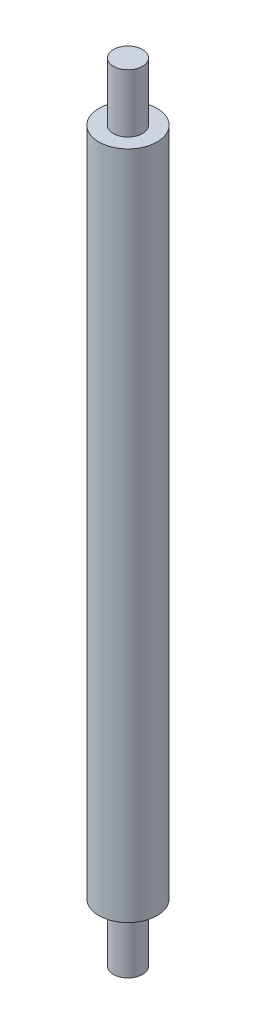
ISO-10303-21;
HEADER;
FILE_DESCRIPTION(('STEP AP214'),'2;1');
FILE_NAME('part.step','',(''),(''),'','','');
FILE_SCHEMA(('AUTOMOTIVE_DESIGN { 1 0 10303 214 1 1 1 1 }'));
ENDSEC;
DATA;
#1=APPLICATION_CONTEXT('core data for automotive mechanical design processes');
#2=APPLICATION_PROTOCOL_DEFINITION('international standard','automotive_design',2000,#1);
#3=PRODUCT_CONTEXT('',#1,'mechanical');
#4=PRODUCT('Part','Part','',(#3));
#5=PRODUCT_RELATED_PRODUCT_CATEGORY('part','',(#4));
#6=PRODUCT_DEFINITION_FORMATION('','',#4);
#7=PRODUCT_DEFINITION_CONTEXT('part definition',#1,'design');
#8=PRODUCT_DEFINITION('design','',#6,#7);
#9=PRODUCT_DEFINITION_SHAPE('','',#8);
#10=(LENGTH_UNIT() NAMED_UNIT(*) SI_UNIT(.MILLI.,.METRE.));
#11=(NAMED_UNIT(*) PLANE_ANGLE_UNIT() SI_UNIT($,.RADIAN.));
#12=(NAMED_UNIT(*) SI_UNIT($,.STERADIAN.) SOLID_ANGLE_UNIT());
#13=UNCERTAINTY_MEASURE_WITH_UNIT(LENGTH_MEASURE(1.E-05),#10,'distance_accuracy_value','');
#14=(GEOMETRIC_REPRESENTATION_CONTEXT(3) GLOBAL_UNCERTAINTY_ASSIGNED_CONTEXT((#13)) GLOBAL_UNIT_ASSIGNED_CONTEXT((#10,
#11,#12)) REPRESENTATION_CONTEXT('',''));
#15=CARTESIAN_POINT('',(0.,0.,0.));
#16=DIRECTION('',(0.,0.,1.));
#17=DIRECTION('',(1.,0.,0.));
#18=AXIS2_PLACEMENT_3D('',#15,#16,#17);
#19=CARTESIAN_POINT('',(-0.951287670134509,115.,2.46214322013451));
#20=DIRECTION('',(0.,-1.,0.));
#21=DIRECTION('',(0.,0.,-1.));
#22=AXIS2_PLACEMENT_3D('',#19,#20,#21);
#23=CYLINDRICAL_SURFACE('',#22,5.);
#24=CARTESIAN_POINT('',(-0.951287670134509,115.,2.46214322013451));
#25=DIRECTION('',(0.,1.,0.));
#26=DIRECTION('',(0.,0.,1.));
#27=AXIS2_PLACEMENT_3D('',#24,#25,#26);
#28=CIRCLE('',#27,5.);
#29=CARTESIAN_POINT('',(-0.951287670134509,115.,7.46214322013451));
#30=VERTEX_POINT('',#29);
#31=EDGE_CURVE('E38',#30,#30,#28,.T.);
#32=ORIENTED_EDGE('',*,*,#31,.F.);
#33=EDGE_LOOP('',(#32));
#34=FACE_BOUND('',#33,.T.);
#35=CARTESIAN_POINT('',(-0.951287670134509,0.,2.46214322013451));
#36=DIRECTION('',(0.,1.,0.));
#37=DIRECTION('',(0.,0.,1.));
#38=AXIS2_PLACEMENT_3D('',#35,#36,#37);
#39=CIRCLE('',#38,5.);
#40=CARTESIAN_POINT('',(-0.951287670134509,0.,7.46214322013451));
#41=VERTEX_POINT('',#40);
#42=EDGE_CURVE('E34',#41,#41,#39,.T.);
#43=ORIENTED_EDGE('',*,*,#42,.T.);
#44=EDGE_LOOP('',(#43));
#45=FACE_BOUND('',#44,.T.);
#46=ADVANCED_FACE('F31',(#34,#45),#23,.T.);
#47=CARTESIAN_POINT('',(-0.951287670134509,115.,2.46214322013451));
#48=DIRECTION('',(0.,1.,0.));
#49=DIRECTION('',(0.,0.,1.));
#50=AXIS2_PLACEMENT_3D('',#47,#48,#49);
#51=PLANE('',#50);
#52=CARTESIAN_POINT('',(-0.951287670134509,115.,2.46214322013451));
#53=DIRECTION('',(0.,-1.,0.));
#54=DIRECTION('',(0.,0.,-1.));
#55=AXIS2_PLACEMENT_3D('',#52,#53,#54);
#56=CIRCLE('',#55,2.5);
#57=CARTESIAN_POINT('',(-0.951287670134509,115.,-0.0378567798654901));
#58=VERTEX_POINT('',#57);
#59=EDGE_CURVE('E48',#58,#58,#56,.T.);
#60=ORIENTED_EDGE('',*,*,#59,.T.);
#61=EDGE_LOOP('',(#60));
#62=FACE_BOUND('',#61,.T.);
#63=ORIENTED_EDGE('',*,*,#31,.T.);
#64=EDGE_LOOP('',(#63));
#65=FACE_BOUND('',#64,.T.);
#66=ADVANCED_FACE('F66',(#62,#65),#51,.T.);
#67=CARTESIAN_POINT('',(-0.951287670134509,0.,2.46214322013451));
#68=DIRECTION('',(0.,1.,0.));
#69=DIRECTION('',(0.,0.,1.));
#70=AXIS2_PLACEMENT_3D('',#67,#68,#69);
#71=PLANE('',#70);
#72=CARTESIAN_POINT('',(-0.951287670134509,0.,2.46214322013451));
#73=DIRECTION('',(0.,-1.,0.));
#74=DIRECTION('',(0.,0.,-1.));
#75=AXIS2_PLACEMENT_3D('',#72,#73,#74);
#76=CIRCLE('',#75,2.5);
#77=CARTESIAN_POINT('',(-0.951287670134509,0.,-0.0378567798654901));
#78=VERTEX_POINT('',#77);
#79=EDGE_CURVE('E10',#78,#78,#76,.T.);
#80=ORIENTED_EDGE('',*,*,#79,.F.);
#81=EDGE_LOOP('',(#80));
#82=FACE_BOUND('',#81,.T.);
#83=ORIENTED_EDGE('',*,*,#42,.F.);
#84=EDGE_LOOP('',(#83));
#85=FACE_BOUND('',#84,.T.);
#86=ADVANCED_FACE('F71',(#82,#85),#71,.F.);
#87=CARTESIAN_POINT('',(-0.951287670134509,-10.,2.46214322013451));
#88=DIRECTION('',(0.,1.,0.));
#89=DIRECTION('',(0.,0.,1.));
#90=AXIS2_PLACEMENT_3D('',#87,#88,#89);
#91=CYLINDRICAL_SURFACE('',#90,2.5);
#92=CARTESIAN_POINT('',(-0.951287670134509,-10.,2.46214322013451));
#93=DIRECTION('',(0.,-1.,0.));
#94=DIRECTION('',(0.,0.,-1.));
#95=AXIS2_PLACEMENT_3D('',#92,#93,#94);
#96=CIRCLE('',#95,2.5);
#97=CARTESIAN_POINT('',(-0.951287670134509,-10.,-0.0378567798654901));
#98=VERTEX_POINT('',#97);
#99=EDGE_CURVE('E44',#98,#98,#96,.T.);
#100=ORIENTED_EDGE('',*,*,#99,.F.);
#101=EDGE_LOOP('',(#100));
#102=FACE_BOUND('',#101,.T.);
#103=ORIENTED_EDGE('',*,*,#79,.T.);
#104=EDGE_LOOP('',(#103));
#105=FACE_BOUND('',#104,.T.);
#106=ADVANCED_FACE('F80',(#102,#105),#91,.T.);
#107=CARTESIAN_POINT('',(-0.951287670134509,-10.,2.46214322013451));
#108=DIRECTION('',(0.,-1.,0.));
#109=DIRECTION('',(0.,0.,-1.));
#110=AXIS2_PLACEMENT_3D('',#107,#108,#109);
#111=PLANE('',#110);
#112=ORIENTED_EDGE('',*,*,#99,.T.);
#113=EDGE_LOOP('',(#112));
#114=FACE_BOUND('',#113,.T.);
#115=ADVANCED_FACE('F63',(#114),#111,.T.);
#116=CARTESIAN_POINT('',(-0.951287670134509,125.,2.46214322013451));
#117=DIRECTION('',(0.,-1.,0.));
#118=DIRECTION('',(0.,0.,-1.));
#119=AXIS2_PLACEMENT_3D('',#116,#117,#118);
#120=CYLINDRICAL_SURFACE('',#119,2.5);
#121=CARTESIAN_POINT('',(-0.951287670134509,125.,2.46214322013451));
#122=DIRECTION('',(0.,-1.,0.));
#123=DIRECTION('',(0.,0.,-1.));
#124=AXIS2_PLACEMENT_3D('',#121,#122,#123);
#125=CIRCLE('',#124,2.5);
#126=CARTESIAN_POINT('',(-0.951287670134509,125.,-0.0378567798654901));
#127=VERTEX_POINT('',#126);
#128=EDGE_CURVE('E47',#127,#127,#125,.T.);
#129=ORIENTED_EDGE('',*,*,#128,.T.);
#130=EDGE_LOOP('',(#129));
#131=FACE_BOUND('',#130,.T.);
#132=ORIENTED_EDGE('',*,*,#59,.F.);
#133=EDGE_LOOP('',(#132));
#134=FACE_BOUND('',#133,.T.);
#135=ADVANCED_FACE('F54',(#131,#134),#120,.T.);
#136=CARTESIAN_POINT('',(-0.951287670134509,125.,2.46214322013451));
#137=DIRECTION('',(0.,1.,0.));
#138=DIRECTION('',(0.,0.,-1.));
#139=AXIS2_PLACEMENT_3D('',#136,#137,#138);
#140=PLANE('',#139);
#141=ORIENTED_EDGE('',*,*,#128,.F.);
#142=EDGE_LOOP('',(#141));
#143=FACE_BOUND('',#142,.T.);
#144=ADVANCED_FACE('F57',(#143),#140,.T.);
#145=CLOSED_SHELL('',(#46,#66,#86,#106,#115,#135,#144));
#146=MANIFOLD_SOLID_BREP('B2',#145);
#147=ADVANCED_BREP_SHAPE_REPRESENTATION('',(#18,#146),#14);
#148=SHAPE_DEFINITION_REPRESENTATION(#9,#147);
ENDSEC;
END-ISO-10303-21;
